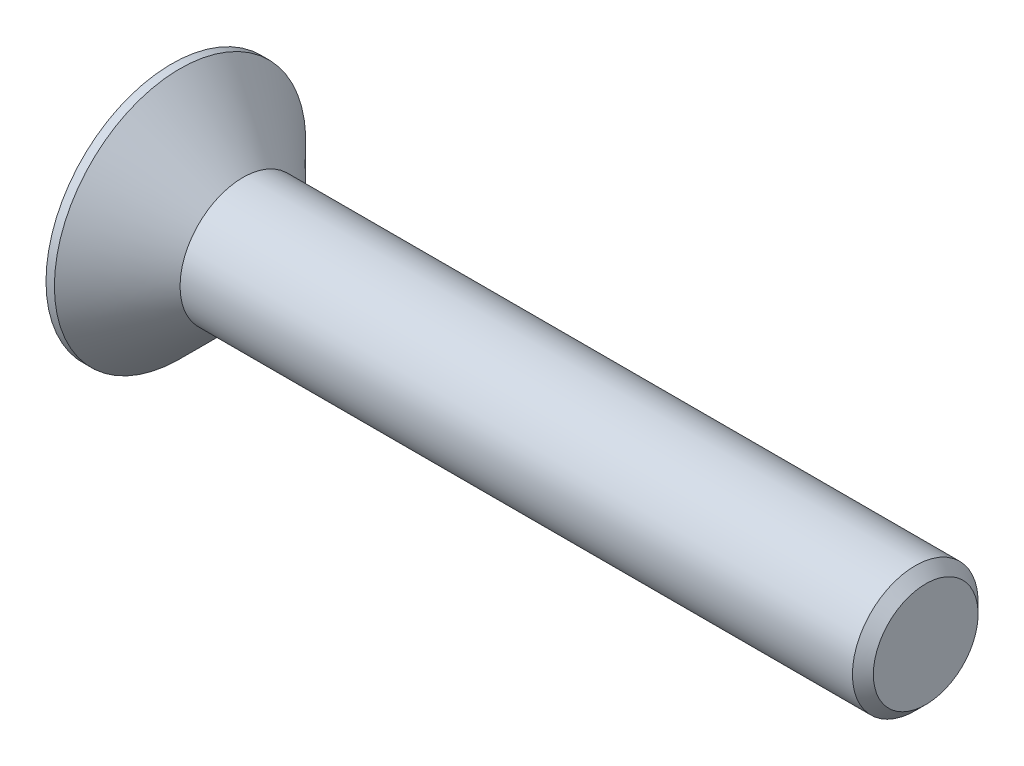
ISO-10303-21;
HEADER;
FILE_DESCRIPTION(('STEP AP214'),'2;1');
FILE_NAME('part.step','',(''),(''),'','','');
FILE_SCHEMA(('AUTOMOTIVE_DESIGN { 1 0 10303 214 1 1 1 1 }'));
ENDSEC;
DATA;
#1=APPLICATION_CONTEXT('core data for automotive mechanical design processes');
#2=APPLICATION_PROTOCOL_DEFINITION('international standard','automotive_design',2000,#1);
#3=PRODUCT_CONTEXT('',#1,'mechanical');
#4=PRODUCT('Part','Part','',(#3));
#5=PRODUCT_RELATED_PRODUCT_CATEGORY('part','',(#4));
#6=PRODUCT_DEFINITION_FORMATION('','',#4);
#7=PRODUCT_DEFINITION_CONTEXT('part definition',#1,'design');
#8=PRODUCT_DEFINITION('design','',#6,#7);
#9=PRODUCT_DEFINITION_SHAPE('','',#8);
#10=(LENGTH_UNIT() NAMED_UNIT(*) SI_UNIT(.MILLI.,.METRE.));
#11=(NAMED_UNIT(*) PLANE_ANGLE_UNIT() SI_UNIT($,.RADIAN.));
#12=(NAMED_UNIT(*) SI_UNIT($,.STERADIAN.) SOLID_ANGLE_UNIT());
#13=UNCERTAINTY_MEASURE_WITH_UNIT(LENGTH_MEASURE(1.E-05),#10,'distance_accuracy_value','');
#14=(GEOMETRIC_REPRESENTATION_CONTEXT(3) GLOBAL_UNCERTAINTY_ASSIGNED_CONTEXT((#13)) GLOBAL_UNIT_ASSIGNED_CONTEXT((#10,
#11,#12)) REPRESENTATION_CONTEXT('',''));
#15=CARTESIAN_POINT('',(0.,0.,0.));
#16=DIRECTION('',(0.,0.,1.));
#17=DIRECTION('',(1.,0.,0.));
#18=AXIS2_PLACEMENT_3D('',#15,#16,#17);
#19=CARTESIAN_POINT('',(0.,0.,0.));
#20=DIRECTION('',(1.,0.,0.));
#21=DIRECTION('',(0.,0.,-1.));
#22=AXIS2_PLACEMENT_3D('',#19,#20,#21);
#23=PLANE('',#22);
#24=DIRECTION('',(0.,0.866025403784439,0.5));
#25=VECTOR('',#24,1.);
#26=CARTESIAN_POINT('',(0.,-1.25,0.721687836487032));
#27=LINE('',#26,#25);
#28=CARTESIAN_POINT('',(0.,-1.25,0.721687836487033));
#29=VERTEX_POINT('',#28);
#30=CARTESIAN_POINT('',(0.,0.,1.44337567297406));
#31=VERTEX_POINT('',#30);
#32=EDGE_CURVE('E120',#29,#31,#27,.T.);
#33=ORIENTED_EDGE('',*,*,#32,.F.);
#34=DIRECTION('',(0.,0.,1.));
#35=VECTOR('',#34,1.);
#36=CARTESIAN_POINT('',(0.,-1.25,-0.721687836487032));
#37=LINE('',#36,#35);
#38=CARTESIAN_POINT('',(0.,-1.25,-0.721687836487032));
#39=VERTEX_POINT('',#38);
#40=EDGE_CURVE('E46',#39,#29,#37,.T.);
#41=ORIENTED_EDGE('',*,*,#40,.F.);
#42=DIRECTION('',(0.,-0.866025403784439,0.5));
#43=VECTOR('',#42,1.);
#44=CARTESIAN_POINT('',(0.,0.,-1.44337567297406));
#45=LINE('',#44,#43);
#46=CARTESIAN_POINT('',(0.,0.,-1.44337567297406));
#47=VERTEX_POINT('',#46);
#48=EDGE_CURVE('E129',#47,#39,#45,.T.);
#49=ORIENTED_EDGE('',*,*,#48,.F.);
#50=DIRECTION('',(0.,-0.866025403784439,-0.5));
#51=VECTOR('',#50,1.);
#52=CARTESIAN_POINT('',(0.,1.25,-0.721687836487032));
#53=LINE('',#52,#51);
#54=CARTESIAN_POINT('',(0.,1.25,-0.721687836487032));
#55=VERTEX_POINT('',#54);
#56=EDGE_CURVE('E127',#55,#47,#53,.T.);
#57=ORIENTED_EDGE('',*,*,#56,.F.);
#58=DIRECTION('',(0.,0.,-1.));
#59=VECTOR('',#58,1.);
#60=CARTESIAN_POINT('',(0.,1.25,0.721687836487031));
#61=LINE('',#60,#59);
#62=CARTESIAN_POINT('',(0.,1.25,0.721687836487031));
#63=VERTEX_POINT('',#62);
#64=EDGE_CURVE('E94',#63,#55,#61,.T.);
#65=ORIENTED_EDGE('',*,*,#64,.F.);
#66=DIRECTION('',(0.,0.866025403784439,-0.5));
#67=VECTOR('',#66,1.);
#68=CARTESIAN_POINT('',(0.,0.,1.44337567297406));
#69=LINE('',#68,#67);
#70=EDGE_CURVE('E123',#31,#63,#69,.T.);
#71=ORIENTED_EDGE('',*,*,#70,.F.);
#72=EDGE_LOOP('',(#33,#41,#49,#57,#65,#71));
#73=FACE_BOUND('',#72,.T.);
#74=CARTESIAN_POINT('',(0.,0.,0.));
#75=DIRECTION('',(-1.,0.,0.));
#76=DIRECTION('',(0.,0.,1.));
#77=AXIS2_PLACEMENT_3D('',#74,#75,#76);
#78=CIRCLE('',#77,3.);
#79=CARTESIAN_POINT('',(0.,0.,3.));
#80=VERTEX_POINT('',#79);
#81=EDGE_CURVE('E11',#80,#80,#78,.T.);
#82=ORIENTED_EDGE('',*,*,#81,.T.);
#83=EDGE_LOOP('',(#82));
#84=FACE_BOUND('',#83,.T.);
#85=ADVANCED_FACE('F32',(#73,#84),#23,.F.);
#86=CARTESIAN_POINT('',(-2.28184155946539,0.,0.));
#87=DIRECTION('',(-1.,0.,0.));
#88=DIRECTION('',(0.,0.,1.));
#89=AXIS2_PLACEMENT_3D('',#86,#87,#88);
#90=CYLINDRICAL_SURFACE('',#89,3.);
#91=ORIENTED_EDGE('',*,*,#81,.F.);
#92=EDGE_LOOP('',(#91));
#93=FACE_BOUND('',#92,.T.);
#94=CARTESIAN_POINT('',(0.2,0.,0.));
#95=DIRECTION('',(-1.,0.,0.));
#96=DIRECTION('',(0.,0.,1.));
#97=AXIS2_PLACEMENT_3D('',#94,#95,#96);
#98=CIRCLE('',#97,3.);
#99=CARTESIAN_POINT('',(0.2,0.,3.));
#100=VERTEX_POINT('',#99);
#101=EDGE_CURVE('E39',#100,#100,#98,.T.);
#102=ORIENTED_EDGE('',*,*,#101,.T.);
#103=EDGE_LOOP('',(#102));
#104=FACE_BOUND('',#103,.T.);
#105=ADVANCED_FACE('F149',(#93,#104),#90,.T.);
#106=CARTESIAN_POINT('',(1.69999999999999,0.,0.));
#107=DIRECTION('',(-1.,0.,0.));
#108=DIRECTION('',(0.,0.,1.));
#109=AXIS2_PLACEMENT_3D('',#106,#107,#108);
#110=CONICAL_SURFACE('',#109,1.5,0.78539816339745);
#111=ORIENTED_EDGE('',*,*,#101,.F.);
#112=EDGE_LOOP('',(#111));
#113=FACE_BOUND('',#112,.T.);
#114=CARTESIAN_POINT('',(1.69999999999999,0.,0.));
#115=DIRECTION('',(-1.,0.,0.));
#116=DIRECTION('',(0.,0.,1.));
#117=AXIS2_PLACEMENT_3D('',#114,#115,#116);
#118=CIRCLE('',#117,1.5);
#119=CARTESIAN_POINT('',(1.69999999999999,0.,1.5));
#120=VERTEX_POINT('',#119);
#121=EDGE_CURVE('E144',#120,#120,#118,.T.);
#122=ORIENTED_EDGE('',*,*,#121,.T.);
#123=EDGE_LOOP('',(#122));
#124=FACE_BOUND('',#123,.T.);
#125=ADVANCED_FACE('F151',(#113,#124),#110,.T.);
#126=CARTESIAN_POINT('',(-2.28184155946539,0.,0.));
#127=DIRECTION('',(-1.,0.,0.));
#128=DIRECTION('',(0.,0.,1.));
#129=AXIS2_PLACEMENT_3D('',#126,#127,#128);
#130=CYLINDRICAL_SURFACE('',#129,1.5);
#131=ORIENTED_EDGE('',*,*,#121,.F.);
#132=EDGE_LOOP('',(#131));
#133=FACE_BOUND('',#132,.T.);
#134=CARTESIAN_POINT('',(17.75,0.,0.));
#135=DIRECTION('',(-1.,0.,0.));
#136=DIRECTION('',(0.,0.,1.));
#137=AXIS2_PLACEMENT_3D('',#134,#135,#136);
#138=CIRCLE('',#137,1.5);
#139=CARTESIAN_POINT('',(17.75,0.,1.5));
#140=VERTEX_POINT('',#139);
#141=EDGE_CURVE('E141',#140,#140,#138,.T.);
#142=ORIENTED_EDGE('',*,*,#141,.T.);
#143=EDGE_LOOP('',(#142));
#144=FACE_BOUND('',#143,.T.);
#145=ADVANCED_FACE('F154',(#133,#144),#130,.T.);
#146=CARTESIAN_POINT('',(18.,0.,0.));
#147=DIRECTION('',(-1.,0.,0.));
#148=DIRECTION('',(0.,0.,1.));
#149=AXIS2_PLACEMENT_3D('',#146,#147,#148);
#150=CONICAL_SURFACE('',#149,1.25,0.785398163397462);
#151=ORIENTED_EDGE('',*,*,#141,.F.);
#152=EDGE_LOOP('',(#151));
#153=FACE_BOUND('',#152,.T.);
#154=CARTESIAN_POINT('',(18.,0.,0.));
#155=DIRECTION('',(-1.,0.,0.));
#156=DIRECTION('',(0.,0.,1.));
#157=AXIS2_PLACEMENT_3D('',#154,#155,#156);
#158=CIRCLE('',#157,1.25);
#159=CARTESIAN_POINT('',(18.,0.,1.25));
#160=VERTEX_POINT('',#159);
#161=EDGE_CURVE('E133',#160,#160,#158,.T.);
#162=ORIENTED_EDGE('',*,*,#161,.T.);
#163=EDGE_LOOP('',(#162));
#164=FACE_BOUND('',#163,.T.);
#165=ADVANCED_FACE('F160',(#153,#164),#150,.T.);
#166=CARTESIAN_POINT('',(18.,1.25,0.));
#167=DIRECTION('',(-1.,0.,0.));
#168=DIRECTION('',(0.,0.,1.));
#169=AXIS2_PLACEMENT_3D('',#166,#167,#168);
#170=PLANE('',#169);
#171=ORIENTED_EDGE('',*,*,#161,.F.);
#172=EDGE_LOOP('',(#171));
#173=FACE_BOUND('',#172,.T.);
#174=ADVANCED_FACE('F166',(#173),#170,.F.);
#175=CARTESIAN_POINT('',(0.8,-1.25,-0.721687836487032));
#176=DIRECTION('',(0.,-1.,0.));
#177=DIRECTION('',(0.,0.,-1.));
#178=AXIS2_PLACEMENT_3D('',#175,#176,#177);
#179=PLANE('',#178);
#180=ORIENTED_EDGE('',*,*,#40,.T.);
#181=DIRECTION('',(-1.,0.,0.));
#182=VECTOR('',#181,1.);
#183=CARTESIAN_POINT('',(0.8,-1.25,0.721687836487032));
#184=LINE('',#183,#182);
#185=CARTESIAN_POINT('',(0.8,-1.25,0.721687836487032));
#186=VERTEX_POINT('',#185);
#187=EDGE_CURVE('E76',#186,#29,#184,.T.);
#188=ORIENTED_EDGE('',*,*,#187,.F.);
#189=DIRECTION('',(0.,0.,1.));
#190=VECTOR('',#189,1.);
#191=CARTESIAN_POINT('',(0.8,-1.25,-0.721687836487032));
#192=LINE('',#191,#190);
#193=CARTESIAN_POINT('',(0.8,-1.25,-0.721687836487032));
#194=VERTEX_POINT('',#193);
#195=EDGE_CURVE('E131',#194,#186,#192,.T.);
#196=ORIENTED_EDGE('',*,*,#195,.F.);
#197=DIRECTION('',(-1.,0.,0.));
#198=VECTOR('',#197,1.);
#199=CARTESIAN_POINT('',(0.8,-1.25,-0.721687836487032));
#200=LINE('',#199,#198);
#201=EDGE_CURVE('E54',#194,#39,#200,.T.);
#202=ORIENTED_EDGE('',*,*,#201,.T.);
#203=EDGE_LOOP('',(#180,#188,#196,#202));
#204=FACE_BOUND('',#203,.T.);
#205=ADVANCED_FACE('F171',(#204),#179,.F.);
#206=CARTESIAN_POINT('',(0.8,0.,-1.44337567297406));
#207=DIRECTION('',(0.,-0.5,-0.866025403784439));
#208=DIRECTION('',(0.,0.866025403784439,-0.5));
#209=AXIS2_PLACEMENT_3D('',#206,#207,#208);
#210=PLANE('',#209);
#211=ORIENTED_EDGE('',*,*,#48,.T.);
#212=ORIENTED_EDGE('',*,*,#201,.F.);
#213=DIRECTION('',(0.,-0.866025403784439,0.5));
#214=VECTOR('',#213,1.);
#215=CARTESIAN_POINT('',(0.8,0.,-1.44337567297406));
#216=LINE('',#215,#214);
#217=CARTESIAN_POINT('',(0.8,0.,-1.44337567297406));
#218=VERTEX_POINT('',#217);
#219=EDGE_CURVE('E106',#218,#194,#216,.T.);
#220=ORIENTED_EDGE('',*,*,#219,.F.);
#221=DIRECTION('',(-1.,0.,0.));
#222=VECTOR('',#221,1.);
#223=CARTESIAN_POINT('',(0.8,0.,-1.44337567297406));
#224=LINE('',#223,#222);
#225=EDGE_CURVE('E98',#218,#47,#224,.T.);
#226=ORIENTED_EDGE('',*,*,#225,.T.);
#227=EDGE_LOOP('',(#211,#212,#220,#226));
#228=FACE_BOUND('',#227,.T.);
#229=ADVANCED_FACE('F176',(#228),#210,.F.);
#230=CARTESIAN_POINT('',(0.8,1.25,-0.721687836487032));
#231=DIRECTION('',(0.,0.5,-0.866025403784439));
#232=DIRECTION('',(0.,0.866025403784439,0.5));
#233=AXIS2_PLACEMENT_3D('',#230,#231,#232);
#234=PLANE('',#233);
#235=ORIENTED_EDGE('',*,*,#56,.T.);
#236=ORIENTED_EDGE('',*,*,#225,.F.);
#237=DIRECTION('',(0.,-0.866025403784439,-0.5));
#238=VECTOR('',#237,1.);
#239=CARTESIAN_POINT('',(0.8,1.25,-0.721687836487032));
#240=LINE('',#239,#238);
#241=CARTESIAN_POINT('',(0.8,1.25,-0.721687836487032));
#242=VERTEX_POINT('',#241);
#243=EDGE_CURVE('E102',#242,#218,#240,.T.);
#244=ORIENTED_EDGE('',*,*,#243,.F.);
#245=DIRECTION('',(-1.,0.,0.));
#246=VECTOR('',#245,1.);
#247=CARTESIAN_POINT('',(0.8,1.25,-0.721687836487032));
#248=LINE('',#247,#246);
#249=EDGE_CURVE('E87',#242,#55,#248,.T.);
#250=ORIENTED_EDGE('',*,*,#249,.T.);
#251=EDGE_LOOP('',(#235,#236,#244,#250));
#252=FACE_BOUND('',#251,.T.);
#253=ADVANCED_FACE('F103',(#252),#234,.F.);
#254=CARTESIAN_POINT('',(0.8,1.25,0.721687836487031));
#255=DIRECTION('',(0.,1.,0.));
#256=DIRECTION('',(0.,0.,1.));
#257=AXIS2_PLACEMENT_3D('',#254,#255,#256);
#258=PLANE('',#257);
#259=ORIENTED_EDGE('',*,*,#64,.T.);
#260=ORIENTED_EDGE('',*,*,#249,.F.);
#261=DIRECTION('',(0.,0.,-1.));
#262=VECTOR('',#261,1.);
#263=CARTESIAN_POINT('',(0.8,1.25,0.721687836487031));
#264=LINE('',#263,#262);
#265=CARTESIAN_POINT('',(0.8,1.25,0.721687836487031));
#266=VERTEX_POINT('',#265);
#267=EDGE_CURVE('E91',#266,#242,#264,.T.);
#268=ORIENTED_EDGE('',*,*,#267,.F.);
#269=DIRECTION('',(-1.,0.,0.));
#270=VECTOR('',#269,1.);
#271=CARTESIAN_POINT('',(0.8,1.25,0.721687836487031));
#272=LINE('',#271,#270);
#273=EDGE_CURVE('E99',#266,#63,#272,.T.);
#274=ORIENTED_EDGE('',*,*,#273,.T.);
#275=EDGE_LOOP('',(#259,#260,#268,#274));
#276=FACE_BOUND('',#275,.T.);
#277=ADVANCED_FACE('F89',(#276),#258,.F.);
#278=CARTESIAN_POINT('',(0.8,0.,1.44337567297406));
#279=DIRECTION('',(0.,0.5,0.866025403784439));
#280=DIRECTION('',(0.,-0.866025403784439,0.5));
#281=AXIS2_PLACEMENT_3D('',#278,#279,#280);
#282=PLANE('',#281);
#283=ORIENTED_EDGE('',*,*,#70,.T.);
#284=ORIENTED_EDGE('',*,*,#273,.F.);
#285=DIRECTION('',(0.,0.866025403784439,-0.5));
#286=VECTOR('',#285,1.);
#287=CARTESIAN_POINT('',(0.8,0.,1.44337567297406));
#288=LINE('',#287,#286);
#289=CARTESIAN_POINT('',(0.8,0.,1.44337567297406));
#290=VERTEX_POINT('',#289);
#291=EDGE_CURVE('E112',#290,#266,#288,.T.);
#292=ORIENTED_EDGE('',*,*,#291,.F.);
#293=DIRECTION('',(-1.,0.,0.));
#294=VECTOR('',#293,1.);
#295=CARTESIAN_POINT('',(0.8,0.,1.44337567297406));
#296=LINE('',#295,#294);
#297=EDGE_CURVE('E136',#290,#31,#296,.T.);
#298=ORIENTED_EDGE('',*,*,#297,.T.);
#299=EDGE_LOOP('',(#283,#284,#292,#298));
#300=FACE_BOUND('',#299,.T.);
#301=ADVANCED_FACE('F202',(#300),#282,.F.);
#302=CARTESIAN_POINT('',(0.8,-1.25,0.721687836487032));
#303=DIRECTION('',(0.,-0.5,0.866025403784439));
#304=DIRECTION('',(0.,-0.866025403784439,-0.5));
#305=AXIS2_PLACEMENT_3D('',#302,#303,#304);
#306=PLANE('',#305);
#307=ORIENTED_EDGE('',*,*,#32,.T.);
#308=ORIENTED_EDGE('',*,*,#297,.F.);
#309=DIRECTION('',(0.,0.866025403784439,0.5));
#310=VECTOR('',#309,1.);
#311=CARTESIAN_POINT('',(0.8,-1.25,0.721687836487032));
#312=LINE('',#311,#310);
#313=EDGE_CURVE('E114',#186,#290,#312,.T.);
#314=ORIENTED_EDGE('',*,*,#313,.F.);
#315=ORIENTED_EDGE('',*,*,#187,.T.);
#316=EDGE_LOOP('',(#307,#308,#314,#315));
#317=FACE_BOUND('',#316,.T.);
#318=ADVANCED_FACE('F190',(#317),#306,.F.);
#319=CARTESIAN_POINT('',(0.8,0.,0.));
#320=DIRECTION('',(-1.,0.,0.));
#321=DIRECTION('',(0.,0.,1.));
#322=AXIS2_PLACEMENT_3D('',#319,#320,#321);
#323=PLANE('',#322);
#324=ORIENTED_EDGE('',*,*,#195,.T.);
#325=ORIENTED_EDGE('',*,*,#313,.T.);
#326=ORIENTED_EDGE('',*,*,#291,.T.);
#327=ORIENTED_EDGE('',*,*,#267,.T.);
#328=ORIENTED_EDGE('',*,*,#243,.T.);
#329=ORIENTED_EDGE('',*,*,#219,.T.);
#330=EDGE_LOOP('',(#324,#325,#326,#327,#328,#329));
#331=FACE_BOUND('',#330,.T.);
#332=ADVANCED_FACE('F109',(#331),#323,.T.);
#333=CLOSED_SHELL('',(#85,#105,#125,#145,#165,#174,#205,#229,#253,#277,#301,#318,#332));
#334=MANIFOLD_SOLID_BREP('B2',#333);
#335=ADVANCED_BREP_SHAPE_REPRESENTATION('',(#18,#334),#14);
#336=SHAPE_DEFINITION_REPRESENTATION(#9,#335);
ENDSEC;
END-ISO-10303-21;
